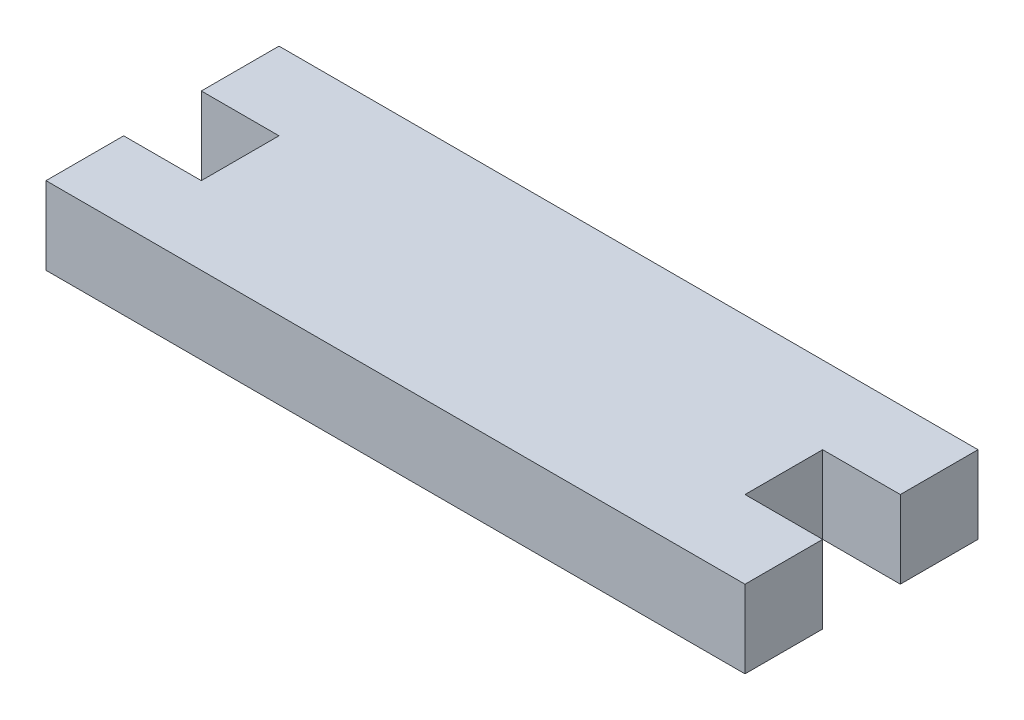
ISO-10303-21;
HEADER;
FILE_DESCRIPTION(('STEP AP214'),'2;1');
FILE_NAME('part.step','',(''),(''),'','','');
FILE_SCHEMA(('AUTOMOTIVE_DESIGN { 1 0 10303 214 1 1 1 1 }'));
ENDSEC;
DATA;
#1=APPLICATION_CONTEXT('core data for automotive mechanical design processes');
#2=APPLICATION_PROTOCOL_DEFINITION('international standard','automotive_design',2000,#1);
#3=PRODUCT_CONTEXT('',#1,'mechanical');
#4=PRODUCT('Part','Part','',(#3));
#5=PRODUCT_RELATED_PRODUCT_CATEGORY('part','',(#4));
#6=PRODUCT_DEFINITION_FORMATION('','',#4);
#7=PRODUCT_DEFINITION_CONTEXT('part definition',#1,'design');
#8=PRODUCT_DEFINITION('design','',#6,#7);
#9=PRODUCT_DEFINITION_SHAPE('','',#8);
#10=(LENGTH_UNIT() NAMED_UNIT(*) SI_UNIT(.MILLI.,.METRE.));
#11=(NAMED_UNIT(*) PLANE_ANGLE_UNIT() SI_UNIT($,.RADIAN.));
#12=(NAMED_UNIT(*) SI_UNIT($,.STERADIAN.) SOLID_ANGLE_UNIT());
#13=UNCERTAINTY_MEASURE_WITH_UNIT(LENGTH_MEASURE(1.E-05),#10,'distance_accuracy_value','');
#14=(GEOMETRIC_REPRESENTATION_CONTEXT(3) GLOBAL_UNCERTAINTY_ASSIGNED_CONTEXT((#13)) GLOBAL_UNIT_ASSIGNED_CONTEXT((#10,
#11,#12)) REPRESENTATION_CONTEXT('',''));
#15=CARTESIAN_POINT('',(0.,0.,0.));
#16=DIRECTION('',(0.,0.,1.));
#17=DIRECTION('',(1.,0.,0.));
#18=AXIS2_PLACEMENT_3D('',#15,#16,#17);
#19=CARTESIAN_POINT('',(28.575,6.35,-9.52500000000001));
#20=DIRECTION('',(-1.,0.,0.));
#21=DIRECTION('',(0.,0.,1.));
#22=AXIS2_PLACEMENT_3D('',#19,#20,#21);
#23=PLANE('',#22);
#24=DIRECTION('',(0.,0.,-1.));
#25=VECTOR('',#24,1.);
#26=CARTESIAN_POINT('',(28.575,0.,-9.52500000000001));
#27=LINE('',#26,#25);
#28=CARTESIAN_POINT('',(28.575,0.,-3.17500000000001));
#29=VERTEX_POINT('',#28);
#30=CARTESIAN_POINT('',(28.575,0.,-9.52500000000001));
#31=VERTEX_POINT('',#30);
#32=EDGE_CURVE('E153',#29,#31,#27,.T.);
#33=ORIENTED_EDGE('',*,*,#32,.T.);
#34=DIRECTION('',(0.,-1.,0.));
#35=VECTOR('',#34,1.);
#36=CARTESIAN_POINT('',(28.575,6.35,-9.52500000000001));
#37=LINE('',#36,#35);
#38=CARTESIAN_POINT('',(28.575,6.35,-9.52500000000001));
#39=VERTEX_POINT('',#38);
#40=EDGE_CURVE('E11',#39,#31,#37,.T.);
#41=ORIENTED_EDGE('',*,*,#40,.F.);
#42=DIRECTION('',(0.,0.,-1.));
#43=VECTOR('',#42,1.);
#44=CARTESIAN_POINT('',(28.575,6.35,-9.52500000000001));
#45=LINE('',#44,#43);
#46=CARTESIAN_POINT('',(28.575,6.35,-3.17500000000001));
#47=VERTEX_POINT('',#46);
#48=EDGE_CURVE('E175',#47,#39,#45,.T.);
#49=ORIENTED_EDGE('',*,*,#48,.F.);
#50=DIRECTION('',(0.,-1.,0.));
#51=VECTOR('',#50,1.);
#52=CARTESIAN_POINT('',(28.575,6.35,-3.17500000000001));
#53=LINE('',#52,#51);
#54=EDGE_CURVE('E149',#47,#29,#53,.T.);
#55=ORIENTED_EDGE('',*,*,#54,.T.);
#56=EDGE_LOOP('',(#33,#41,#49,#55));
#57=FACE_BOUND('',#56,.T.);
#58=ADVANCED_FACE('F33',(#57),#23,.F.);
#59=CARTESIAN_POINT('',(-28.575,6.35,-9.525));
#60=DIRECTION('',(0.,0.,1.));
#61=DIRECTION('',(1.,0.,0.));
#62=AXIS2_PLACEMENT_3D('',#59,#60,#61);
#63=PLANE('',#62);
#64=DIRECTION('',(-1.,0.,0.));
#65=VECTOR('',#64,1.);
#66=CARTESIAN_POINT('',(-28.575,0.,-9.525));
#67=LINE('',#66,#65);
#68=CARTESIAN_POINT('',(-28.575,0.,-9.525));
#69=VERTEX_POINT('',#68);
#70=EDGE_CURVE('E156',#31,#69,#67,.T.);
#71=ORIENTED_EDGE('',*,*,#70,.T.);
#72=DIRECTION('',(0.,-1.,0.));
#73=VECTOR('',#72,1.);
#74=CARTESIAN_POINT('',(-28.575,6.35,-9.525));
#75=LINE('',#74,#73);
#76=CARTESIAN_POINT('',(-28.575,6.35,-9.525));
#77=VERTEX_POINT('',#76);
#78=EDGE_CURVE('E41',#77,#69,#75,.T.);
#79=ORIENTED_EDGE('',*,*,#78,.F.);
#80=DIRECTION('',(-1.,0.,0.));
#81=VECTOR('',#80,1.);
#82=CARTESIAN_POINT('',(-28.575,6.35,-9.525));
#83=LINE('',#82,#81);
#84=EDGE_CURVE('E104',#39,#77,#83,.T.);
#85=ORIENTED_EDGE('',*,*,#84,.F.);
#86=ORIENTED_EDGE('',*,*,#40,.T.);
#87=EDGE_LOOP('',(#71,#79,#85,#86));
#88=FACE_BOUND('',#87,.T.);
#89=ADVANCED_FACE('F253',(#88),#63,.F.);
#90=CARTESIAN_POINT('',(-28.575,6.35,-3.175));
#91=DIRECTION('',(1.,0.,0.));
#92=DIRECTION('',(0.,0.,-1.));
#93=AXIS2_PLACEMENT_3D('',#90,#91,#92);
#94=PLANE('',#93);
#95=DIRECTION('',(0.,0.,1.));
#96=VECTOR('',#95,1.);
#97=CARTESIAN_POINT('',(-28.575,0.,-3.175));
#98=LINE('',#97,#96);
#99=CARTESIAN_POINT('',(-28.575,0.,-3.175));
#100=VERTEX_POINT('',#99);
#101=EDGE_CURVE('E158',#69,#100,#98,.T.);
#102=ORIENTED_EDGE('',*,*,#101,.T.);
#103=DIRECTION('',(0.,-1.,0.));
#104=VECTOR('',#103,1.);
#105=CARTESIAN_POINT('',(-28.575,6.35,-3.175));
#106=LINE('',#105,#104);
#107=CARTESIAN_POINT('',(-28.575,6.35,-3.175));
#108=VERTEX_POINT('',#107);
#109=EDGE_CURVE('E194',#108,#100,#106,.T.);
#110=ORIENTED_EDGE('',*,*,#109,.F.);
#111=DIRECTION('',(0.,0.,1.));
#112=VECTOR('',#111,1.);
#113=CARTESIAN_POINT('',(-28.575,6.35,-3.175));
#114=LINE('',#113,#112);
#115=EDGE_CURVE('E202',#77,#108,#114,.T.);
#116=ORIENTED_EDGE('',*,*,#115,.F.);
#117=ORIENTED_EDGE('',*,*,#78,.T.);
#118=EDGE_LOOP('',(#102,#110,#116,#117));
#119=FACE_BOUND('',#118,.T.);
#120=ADVANCED_FACE('F200',(#119),#94,.F.);
#121=CARTESIAN_POINT('',(-22.225,6.35,-3.175));
#122=DIRECTION('',(0.,0.,-1.));
#123=DIRECTION('',(-1.,0.,0.));
#124=AXIS2_PLACEMENT_3D('',#121,#122,#123);
#125=PLANE('',#124);
#126=DIRECTION('',(1.,0.,0.));
#127=VECTOR('',#126,1.);
#128=CARTESIAN_POINT('',(-22.225,0.,-3.175));
#129=LINE('',#128,#127);
#130=CARTESIAN_POINT('',(-22.225,0.,-3.175));
#131=VERTEX_POINT('',#130);
#132=EDGE_CURVE('E160',#100,#131,#129,.T.);
#133=ORIENTED_EDGE('',*,*,#132,.T.);
#134=DIRECTION('',(0.,-1.,0.));
#135=VECTOR('',#134,1.);
#136=CARTESIAN_POINT('',(-22.225,6.35,-3.175));
#137=LINE('',#136,#135);
#138=CARTESIAN_POINT('',(-22.225,6.35,-3.175));
#139=VERTEX_POINT('',#138);
#140=EDGE_CURVE('E191',#139,#131,#137,.T.);
#141=ORIENTED_EDGE('',*,*,#140,.F.);
#142=DIRECTION('',(1.,0.,0.));
#143=VECTOR('',#142,1.);
#144=CARTESIAN_POINT('',(-22.225,6.35,-3.175));
#145=LINE('',#144,#143);
#146=EDGE_CURVE('E220',#108,#139,#145,.T.);
#147=ORIENTED_EDGE('',*,*,#146,.F.);
#148=ORIENTED_EDGE('',*,*,#109,.T.);
#149=EDGE_LOOP('',(#133,#141,#147,#148));
#150=FACE_BOUND('',#149,.T.);
#151=ADVANCED_FACE('F211',(#150),#125,.F.);
#152=CARTESIAN_POINT('',(-22.225,6.35,3.175));
#153=DIRECTION('',(1.,0.,0.));
#154=DIRECTION('',(0.,0.,-1.));
#155=AXIS2_PLACEMENT_3D('',#152,#153,#154);
#156=PLANE('',#155);
#157=DIRECTION('',(0.,0.,1.));
#158=VECTOR('',#157,1.);
#159=CARTESIAN_POINT('',(-22.225,0.,3.175));
#160=LINE('',#159,#158);
#161=CARTESIAN_POINT('',(-22.225,0.,3.175));
#162=VERTEX_POINT('',#161);
#163=EDGE_CURVE('E162',#131,#162,#160,.T.);
#164=ORIENTED_EDGE('',*,*,#163,.T.);
#165=DIRECTION('',(0.,-1.,0.));
#166=VECTOR('',#165,1.);
#167=CARTESIAN_POINT('',(-22.225,6.35,3.175));
#168=LINE('',#167,#166);
#169=CARTESIAN_POINT('',(-22.225,6.35,3.175));
#170=VERTEX_POINT('',#169);
#171=EDGE_CURVE('E188',#170,#162,#168,.T.);
#172=ORIENTED_EDGE('',*,*,#171,.F.);
#173=DIRECTION('',(0.,0.,1.));
#174=VECTOR('',#173,1.);
#175=CARTESIAN_POINT('',(-22.225,6.35,3.175));
#176=LINE('',#175,#174);
#177=EDGE_CURVE('E217',#139,#170,#176,.T.);
#178=ORIENTED_EDGE('',*,*,#177,.F.);
#179=ORIENTED_EDGE('',*,*,#140,.T.);
#180=EDGE_LOOP('',(#164,#172,#178,#179));
#181=FACE_BOUND('',#180,.T.);
#182=ADVANCED_FACE('F215',(#181),#156,.F.);
#183=CARTESIAN_POINT('',(-28.575,6.35,3.175));
#184=DIRECTION('',(0.,0.,1.));
#185=DIRECTION('',(1.,0.,0.));
#186=AXIS2_PLACEMENT_3D('',#183,#184,#185);
#187=PLANE('',#186);
#188=DIRECTION('',(-1.,0.,0.));
#189=VECTOR('',#188,1.);
#190=CARTESIAN_POINT('',(-28.575,0.,3.175));
#191=LINE('',#190,#189);
#192=CARTESIAN_POINT('',(-28.575,0.,3.175));
#193=VERTEX_POINT('',#192);
#194=EDGE_CURVE('E164',#162,#193,#191,.T.);
#195=ORIENTED_EDGE('',*,*,#194,.T.);
#196=DIRECTION('',(0.,-1.,0.));
#197=VECTOR('',#196,1.);
#198=CARTESIAN_POINT('',(-28.575,6.35,3.175));
#199=LINE('',#198,#197);
#200=CARTESIAN_POINT('',(-28.575,6.35,3.175));
#201=VERTEX_POINT('',#200);
#202=EDGE_CURVE('E185',#201,#193,#199,.T.);
#203=ORIENTED_EDGE('',*,*,#202,.F.);
#204=DIRECTION('',(-1.,0.,0.));
#205=VECTOR('',#204,1.);
#206=CARTESIAN_POINT('',(-28.575,6.35,3.175));
#207=LINE('',#206,#205);
#208=EDGE_CURVE('E219',#170,#201,#207,.T.);
#209=ORIENTED_EDGE('',*,*,#208,.F.);
#210=ORIENTED_EDGE('',*,*,#171,.T.);
#211=EDGE_LOOP('',(#195,#203,#209,#210));
#212=FACE_BOUND('',#211,.T.);
#213=ADVANCED_FACE('F266',(#212),#187,.F.);
#214=CARTESIAN_POINT('',(-28.575,6.35,9.525));
#215=DIRECTION('',(1.,0.,0.));
#216=DIRECTION('',(0.,0.,-1.));
#217=AXIS2_PLACEMENT_3D('',#214,#215,#216);
#218=PLANE('',#217);
#219=DIRECTION('',(0.,0.,1.));
#220=VECTOR('',#219,1.);
#221=CARTESIAN_POINT('',(-28.575,0.,9.525));
#222=LINE('',#221,#220);
#223=CARTESIAN_POINT('',(-28.575,0.,9.525));
#224=VERTEX_POINT('',#223);
#225=EDGE_CURVE('E166',#193,#224,#222,.T.);
#226=ORIENTED_EDGE('',*,*,#225,.T.);
#227=DIRECTION('',(0.,-1.,0.));
#228=VECTOR('',#227,1.);
#229=CARTESIAN_POINT('',(-28.575,6.35,9.525));
#230=LINE('',#229,#228);
#231=CARTESIAN_POINT('',(-28.575,6.35,9.525));
#232=VERTEX_POINT('',#231);
#233=EDGE_CURVE('E182',#232,#224,#230,.T.);
#234=ORIENTED_EDGE('',*,*,#233,.F.);
#235=DIRECTION('',(0.,0.,1.));
#236=VECTOR('',#235,1.);
#237=CARTESIAN_POINT('',(-28.575,6.35,9.525));
#238=LINE('',#237,#236);
#239=EDGE_CURVE('E222',#201,#232,#238,.T.);
#240=ORIENTED_EDGE('',*,*,#239,.F.);
#241=ORIENTED_EDGE('',*,*,#202,.T.);
#242=EDGE_LOOP('',(#226,#234,#240,#241));
#243=FACE_BOUND('',#242,.T.);
#244=ADVANCED_FACE('F269',(#243),#218,.F.);
#245=CARTESIAN_POINT('',(-28.575,6.35,9.525));
#246=DIRECTION('',(0.,0.,-1.));
#247=DIRECTION('',(-1.,0.,0.));
#248=AXIS2_PLACEMENT_3D('',#245,#246,#247);
#249=PLANE('',#248);
#250=DIRECTION('',(1.,0.,0.));
#251=VECTOR('',#250,1.);
#252=CARTESIAN_POINT('',(-28.575,0.,9.525));
#253=LINE('',#252,#251);
#254=CARTESIAN_POINT('',(28.575,0.,9.52499999999999));
#255=VERTEX_POINT('',#254);
#256=EDGE_CURVE('E168',#224,#255,#253,.T.);
#257=ORIENTED_EDGE('',*,*,#256,.T.);
#258=DIRECTION('',(0.,-1.,0.));
#259=VECTOR('',#258,1.);
#260=CARTESIAN_POINT('',(28.575,6.35,9.52499999999999));
#261=LINE('',#260,#259);
#262=CARTESIAN_POINT('',(28.575,6.35,9.52499999999999));
#263=VERTEX_POINT('',#262);
#264=EDGE_CURVE('E179',#263,#255,#261,.T.);
#265=ORIENTED_EDGE('',*,*,#264,.F.);
#266=DIRECTION('',(1.,0.,0.));
#267=VECTOR('',#266,1.);
#268=CARTESIAN_POINT('',(-28.575,6.35,9.525));
#269=LINE('',#268,#267);
#270=EDGE_CURVE('E228',#232,#263,#269,.T.);
#271=ORIENTED_EDGE('',*,*,#270,.F.);
#272=ORIENTED_EDGE('',*,*,#233,.T.);
#273=EDGE_LOOP('',(#257,#265,#271,#272));
#274=FACE_BOUND('',#273,.T.);
#275=ADVANCED_FACE('F234',(#274),#249,.F.);
#276=CARTESIAN_POINT('',(28.575,6.35,3.17499999999999));
#277=DIRECTION('',(-1.,0.,0.));
#278=DIRECTION('',(0.,0.,1.));
#279=AXIS2_PLACEMENT_3D('',#276,#277,#278);
#280=PLANE('',#279);
#281=DIRECTION('',(0.,0.,-1.));
#282=VECTOR('',#281,1.);
#283=CARTESIAN_POINT('',(28.575,0.,3.17499999999999));
#284=LINE('',#283,#282);
#285=CARTESIAN_POINT('',(28.575,0.,3.17499999999999));
#286=VERTEX_POINT('',#285);
#287=EDGE_CURVE('E170',#255,#286,#284,.T.);
#288=ORIENTED_EDGE('',*,*,#287,.T.);
#289=DIRECTION('',(0.,-1.,0.));
#290=VECTOR('',#289,1.);
#291=CARTESIAN_POINT('',(28.575,6.35,3.17499999999999));
#292=LINE('',#291,#290);
#293=CARTESIAN_POINT('',(28.575,6.35,3.17499999999999));
#294=VERTEX_POINT('',#293);
#295=EDGE_CURVE('E144',#294,#286,#292,.T.);
#296=ORIENTED_EDGE('',*,*,#295,.F.);
#297=DIRECTION('',(0.,0.,-1.));
#298=VECTOR('',#297,1.);
#299=CARTESIAN_POINT('',(28.575,6.35,3.17499999999999));
#300=LINE('',#299,#298);
#301=EDGE_CURVE('E135',#263,#294,#300,.T.);
#302=ORIENTED_EDGE('',*,*,#301,.F.);
#303=ORIENTED_EDGE('',*,*,#264,.T.);
#304=EDGE_LOOP('',(#288,#296,#302,#303));
#305=FACE_BOUND('',#304,.T.);
#306=ADVANCED_FACE('F238',(#305),#280,.F.);
#307=CARTESIAN_POINT('',(28.575,6.35,3.17499999999999));
#308=DIRECTION('',(0.,0.,1.));
#309=DIRECTION('',(1.,0.,0.));
#310=AXIS2_PLACEMENT_3D('',#307,#308,#309);
#311=PLANE('',#310);
#312=DIRECTION('',(-1.,0.,0.));
#313=VECTOR('',#312,1.);
#314=CARTESIAN_POINT('',(28.575,0.,3.17499999999999));
#315=LINE('',#314,#313);
#316=CARTESIAN_POINT('',(22.225,0.,3.17499999999999));
#317=VERTEX_POINT('',#316);
#318=EDGE_CURVE('E143',#286,#317,#315,.T.);
#319=ORIENTED_EDGE('',*,*,#318,.T.);
#320=DIRECTION('',(0.,-1.,0.));
#321=VECTOR('',#320,1.);
#322=CARTESIAN_POINT('',(22.225,6.35,3.17499999999999));
#323=LINE('',#322,#321);
#324=CARTESIAN_POINT('',(22.225,6.35,3.17499999999999));
#325=VERTEX_POINT('',#324);
#326=EDGE_CURVE('E140',#325,#317,#323,.T.);
#327=ORIENTED_EDGE('',*,*,#326,.F.);
#328=DIRECTION('',(-1.,0.,0.));
#329=VECTOR('',#328,1.);
#330=CARTESIAN_POINT('',(28.575,6.35,3.17499999999999));
#331=LINE('',#330,#329);
#332=EDGE_CURVE('E129',#294,#325,#331,.T.);
#333=ORIENTED_EDGE('',*,*,#332,.F.);
#334=ORIENTED_EDGE('',*,*,#295,.T.);
#335=EDGE_LOOP('',(#319,#327,#333,#334));
#336=FACE_BOUND('',#335,.T.);
#337=ADVANCED_FACE('F141',(#336),#311,.F.);
#338=CARTESIAN_POINT('',(22.225,6.35,3.17499999999999));
#339=DIRECTION('',(-1.,0.,0.));
#340=DIRECTION('',(0.,0.,1.));
#341=AXIS2_PLACEMENT_3D('',#338,#339,#340);
#342=PLANE('',#341);
#343=DIRECTION('',(0.,0.,-1.));
#344=VECTOR('',#343,1.);
#345=CARTESIAN_POINT('',(22.225,0.,3.17499999999999));
#346=LINE('',#345,#344);
#347=CARTESIAN_POINT('',(22.225,0.,-3.17500000000001));
#348=VERTEX_POINT('',#347);
#349=EDGE_CURVE('E90',#317,#348,#346,.T.);
#350=ORIENTED_EDGE('',*,*,#349,.T.);
#351=DIRECTION('',(0.,-1.,0.));
#352=VECTOR('',#351,1.);
#353=CARTESIAN_POINT('',(22.225,6.35,-3.17500000000001));
#354=LINE('',#353,#352);
#355=CARTESIAN_POINT('',(22.225,6.35,-3.17500000000001));
#356=VERTEX_POINT('',#355);
#357=EDGE_CURVE('E145',#356,#348,#354,.T.);
#358=ORIENTED_EDGE('',*,*,#357,.F.);
#359=DIRECTION('',(0.,0.,-1.));
#360=VECTOR('',#359,1.);
#361=CARTESIAN_POINT('',(22.225,6.35,3.17499999999999));
#362=LINE('',#361,#360);
#363=EDGE_CURVE('E133',#325,#356,#362,.T.);
#364=ORIENTED_EDGE('',*,*,#363,.F.);
#365=ORIENTED_EDGE('',*,*,#326,.T.);
#366=EDGE_LOOP('',(#350,#358,#364,#365));
#367=FACE_BOUND('',#366,.T.);
#368=ADVANCED_FACE('F147',(#367),#342,.F.);
#369=CARTESIAN_POINT('',(22.225,6.35,-3.17500000000001));
#370=DIRECTION('',(0.,0.,-1.));
#371=DIRECTION('',(-1.,0.,0.));
#372=AXIS2_PLACEMENT_3D('',#369,#370,#371);
#373=PLANE('',#372);
#374=DIRECTION('',(1.,0.,0.));
#375=VECTOR('',#374,1.);
#376=CARTESIAN_POINT('',(22.225,0.,-3.17500000000001));
#377=LINE('',#376,#375);
#378=EDGE_CURVE('E96',#348,#29,#377,.T.);
#379=ORIENTED_EDGE('',*,*,#378,.T.);
#380=ORIENTED_EDGE('',*,*,#54,.F.);
#381=DIRECTION('',(1.,0.,0.));
#382=VECTOR('',#381,1.);
#383=CARTESIAN_POINT('',(22.225,6.35,-3.17500000000001));
#384=LINE('',#383,#382);
#385=EDGE_CURVE('E49',#356,#47,#384,.T.);
#386=ORIENTED_EDGE('',*,*,#385,.F.);
#387=ORIENTED_EDGE('',*,*,#357,.T.);
#388=EDGE_LOOP('',(#379,#380,#386,#387));
#389=FACE_BOUND('',#388,.T.);
#390=ADVANCED_FACE('F242',(#389),#373,.F.);
#391=CARTESIAN_POINT('',(0.,6.35,0.));
#392=DIRECTION('',(0.,1.,0.));
#393=DIRECTION('',(0.,0.,1.));
#394=AXIS2_PLACEMENT_3D('',#391,#392,#393);
#395=PLANE('',#394);
#396=ORIENTED_EDGE('',*,*,#48,.T.);
#397=ORIENTED_EDGE('',*,*,#84,.T.);
#398=ORIENTED_EDGE('',*,*,#115,.T.);
#399=ORIENTED_EDGE('',*,*,#146,.T.);
#400=ORIENTED_EDGE('',*,*,#177,.T.);
#401=ORIENTED_EDGE('',*,*,#208,.T.);
#402=ORIENTED_EDGE('',*,*,#239,.T.);
#403=ORIENTED_EDGE('',*,*,#270,.T.);
#404=ORIENTED_EDGE('',*,*,#301,.T.);
#405=ORIENTED_EDGE('',*,*,#332,.T.);
#406=ORIENTED_EDGE('',*,*,#363,.T.);
#407=ORIENTED_EDGE('',*,*,#385,.T.);
#408=EDGE_LOOP('',(#396,#397,#398,#399,#400,#401,#402,#403,#404,#405,#406,#407));
#409=FACE_BOUND('',#408,.T.);
#410=ADVANCED_FACE('F131',(#409),#395,.T.);
#411=CARTESIAN_POINT('',(0.,0.,0.));
#412=DIRECTION('',(0.,1.,0.));
#413=DIRECTION('',(0.,0.,1.));
#414=AXIS2_PLACEMENT_3D('',#411,#412,#413);
#415=PLANE('',#414);
#416=ORIENTED_EDGE('',*,*,#32,.F.);
#417=ORIENTED_EDGE('',*,*,#378,.F.);
#418=ORIENTED_EDGE('',*,*,#349,.F.);
#419=ORIENTED_EDGE('',*,*,#318,.F.);
#420=ORIENTED_EDGE('',*,*,#287,.F.);
#421=ORIENTED_EDGE('',*,*,#256,.F.);
#422=ORIENTED_EDGE('',*,*,#225,.F.);
#423=ORIENTED_EDGE('',*,*,#194,.F.);
#424=ORIENTED_EDGE('',*,*,#163,.F.);
#425=ORIENTED_EDGE('',*,*,#132,.F.);
#426=ORIENTED_EDGE('',*,*,#101,.F.);
#427=ORIENTED_EDGE('',*,*,#70,.F.);
#428=EDGE_LOOP('',(#416,#417,#418,#419,#420,#421,#422,#423,#424,#425,#426,#427));
#429=FACE_BOUND('',#428,.T.);
#430=ADVANCED_FACE('F206',(#429),#415,.F.);
#431=CLOSED_SHELL('',(#58,#89,#120,#151,#182,#213,#244,#275,#306,#337,#368,#390,#410,#430));
#432=MANIFOLD_SOLID_BREP('B2',#431);
#433=ADVANCED_BREP_SHAPE_REPRESENTATION('',(#18,#432),#14);
#434=SHAPE_DEFINITION_REPRESENTATION(#9,#433);
ENDSEC;
END-ISO-10303-21;
